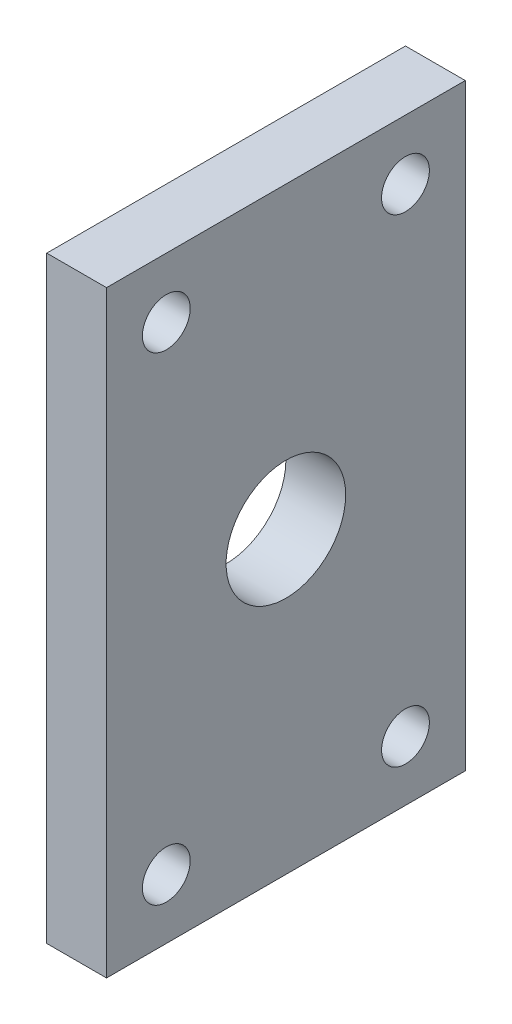
ISO-10303-21;
HEADER;
FILE_DESCRIPTION(('STEP AP214'),'2;1');
FILE_NAME('part.step','',(''),(''),'','','');
FILE_SCHEMA(('AUTOMOTIVE_DESIGN { 1 0 10303 214 1 1 1 1 }'));
ENDSEC;
DATA;
#1=APPLICATION_CONTEXT('core data for automotive mechanical design processes');
#2=APPLICATION_PROTOCOL_DEFINITION('international standard','automotive_design',2000,#1);
#3=PRODUCT_CONTEXT('',#1,'mechanical');
#4=PRODUCT('Part','Part','',(#3));
#5=PRODUCT_RELATED_PRODUCT_CATEGORY('part','',(#4));
#6=PRODUCT_DEFINITION_FORMATION('','',#4);
#7=PRODUCT_DEFINITION_CONTEXT('part definition',#1,'design');
#8=PRODUCT_DEFINITION('design','',#6,#7);
#9=PRODUCT_DEFINITION_SHAPE('','',#8);
#10=(LENGTH_UNIT() NAMED_UNIT(*) SI_UNIT(.MILLI.,.METRE.));
#11=(NAMED_UNIT(*) PLANE_ANGLE_UNIT() SI_UNIT($,.RADIAN.));
#12=(NAMED_UNIT(*) SI_UNIT($,.STERADIAN.) SOLID_ANGLE_UNIT());
#13=UNCERTAINTY_MEASURE_WITH_UNIT(LENGTH_MEASURE(1.E-05),#10,'distance_accuracy_value','');
#14=(GEOMETRIC_REPRESENTATION_CONTEXT(3) GLOBAL_UNCERTAINTY_ASSIGNED_CONTEXT((#13)) GLOBAL_UNIT_ASSIGNED_CONTEXT((#10,
#11,#12)) REPRESENTATION_CONTEXT('',''));
#15=CARTESIAN_POINT('',(0.,0.,0.));
#16=DIRECTION('',(0.,0.,1.));
#17=DIRECTION('',(1.,0.,0.));
#18=AXIS2_PLACEMENT_3D('',#15,#16,#17);
#19=CARTESIAN_POINT('',(10.,0.,0.));
#20=DIRECTION('',(0.,1.,0.));
#21=DIRECTION('',(0.,0.,1.));
#22=AXIS2_PLACEMENT_3D('',#19,#20,#21);
#23=PLANE('',#22);
#24=DIRECTION('',(0.,0.,-1.));
#25=VECTOR('',#24,1.);
#26=CARTESIAN_POINT('',(0.,0.,0.));
#27=LINE('',#26,#25);
#28=CARTESIAN_POINT('',(0.,0.,60.));
#29=VERTEX_POINT('',#28);
#30=CARTESIAN_POINT('',(0.,0.,0.));
#31=VERTEX_POINT('',#30);
#32=EDGE_CURVE('E102',#29,#31,#27,.T.);
#33=ORIENTED_EDGE('',*,*,#32,.T.);
#34=DIRECTION('',(-1.,0.,0.));
#35=VECTOR('',#34,1.);
#36=CARTESIAN_POINT('',(10.,0.,0.));
#37=LINE('',#36,#35);
#38=CARTESIAN_POINT('',(10.,0.,0.));
#39=VERTEX_POINT('',#38);
#40=EDGE_CURVE('E11',#39,#31,#37,.T.);
#41=ORIENTED_EDGE('',*,*,#40,.F.);
#42=DIRECTION('',(0.,0.,-1.));
#43=VECTOR('',#42,1.);
#44=CARTESIAN_POINT('',(10.,0.,0.));
#45=LINE('',#44,#43);
#46=CARTESIAN_POINT('',(10.,0.,60.));
#47=VERTEX_POINT('',#46);
#48=EDGE_CURVE('E90',#47,#39,#45,.T.);
#49=ORIENTED_EDGE('',*,*,#48,.F.);
#50=DIRECTION('',(-1.,0.,0.));
#51=VECTOR('',#50,1.);
#52=CARTESIAN_POINT('',(10.,0.,60.));
#53=LINE('',#52,#51);
#54=EDGE_CURVE('E98',#47,#29,#53,.T.);
#55=ORIENTED_EDGE('',*,*,#54,.T.);
#56=EDGE_LOOP('',(#33,#41,#49,#55));
#57=FACE_BOUND('',#56,.T.);
#58=ADVANCED_FACE('F39',(#57),#23,.F.);
#59=CARTESIAN_POINT('',(10.,0.,0.));
#60=DIRECTION('',(0.,0.,1.));
#61=DIRECTION('',(1.,0.,0.));
#62=AXIS2_PLACEMENT_3D('',#59,#60,#61);
#63=PLANE('',#62);
#64=DIRECTION('',(0.,1.,0.));
#65=VECTOR('',#64,1.);
#66=CARTESIAN_POINT('',(0.,0.,0.));
#67=LINE('',#66,#65);
#68=CARTESIAN_POINT('',(0.,100.,0.));
#69=VERTEX_POINT('',#68);
#70=EDGE_CURVE('E94',#31,#69,#67,.T.);
#71=ORIENTED_EDGE('',*,*,#70,.T.);
#72=DIRECTION('',(-1.,0.,0.));
#73=VECTOR('',#72,1.);
#74=CARTESIAN_POINT('',(10.,100.,0.));
#75=LINE('',#74,#73);
#76=CARTESIAN_POINT('',(10.,100.,0.));
#77=VERTEX_POINT('',#76);
#78=EDGE_CURVE('E47',#77,#69,#75,.T.);
#79=ORIENTED_EDGE('',*,*,#78,.F.);
#80=DIRECTION('',(0.,1.,0.));
#81=VECTOR('',#80,1.);
#82=CARTESIAN_POINT('',(10.,0.,0.));
#83=LINE('',#82,#81);
#84=EDGE_CURVE('E85',#39,#77,#83,.T.);
#85=ORIENTED_EDGE('',*,*,#84,.F.);
#86=ORIENTED_EDGE('',*,*,#40,.T.);
#87=EDGE_LOOP('',(#71,#79,#85,#86));
#88=FACE_BOUND('',#87,.T.);
#89=ADVANCED_FACE('F93',(#88),#63,.F.);
#90=CARTESIAN_POINT('',(10.,100.,0.));
#91=DIRECTION('',(0.,-1.,0.));
#92=DIRECTION('',(0.,0.,-1.));
#93=AXIS2_PLACEMENT_3D('',#90,#91,#92);
#94=PLANE('',#93);
#95=DIRECTION('',(0.,0.,1.));
#96=VECTOR('',#95,1.);
#97=CARTESIAN_POINT('',(0.,100.,0.));
#98=LINE('',#97,#96);
#99=CARTESIAN_POINT('',(0.,100.,60.));
#100=VERTEX_POINT('',#99);
#101=EDGE_CURVE('E72',#69,#100,#98,.T.);
#102=ORIENTED_EDGE('',*,*,#101,.T.);
#103=DIRECTION('',(-1.,0.,0.));
#104=VECTOR('',#103,1.);
#105=CARTESIAN_POINT('',(10.,100.,60.));
#106=LINE('',#105,#104);
#107=CARTESIAN_POINT('',(10.,100.,60.));
#108=VERTEX_POINT('',#107);
#109=EDGE_CURVE('E95',#108,#100,#106,.T.);
#110=ORIENTED_EDGE('',*,*,#109,.F.);
#111=DIRECTION('',(0.,0.,1.));
#112=VECTOR('',#111,1.);
#113=CARTESIAN_POINT('',(10.,100.,0.));
#114=LINE('',#113,#112);
#115=EDGE_CURVE('E88',#77,#108,#114,.T.);
#116=ORIENTED_EDGE('',*,*,#115,.F.);
#117=ORIENTED_EDGE('',*,*,#78,.T.);
#118=EDGE_LOOP('',(#102,#110,#116,#117));
#119=FACE_BOUND('',#118,.T.);
#120=ADVANCED_FACE('F96',(#119),#94,.F.);
#121=CARTESIAN_POINT('',(10.,0.,60.));
#122=DIRECTION('',(0.,0.,-1.));
#123=DIRECTION('',(-1.,0.,0.));
#124=AXIS2_PLACEMENT_3D('',#121,#122,#123);
#125=PLANE('',#124);
#126=DIRECTION('',(0.,-1.,0.));
#127=VECTOR('',#126,1.);
#128=CARTESIAN_POINT('',(0.,0.,60.));
#129=LINE('',#128,#127);
#130=EDGE_CURVE('E78',#100,#29,#129,.T.);
#131=ORIENTED_EDGE('',*,*,#130,.T.);
#132=ORIENTED_EDGE('',*,*,#54,.F.);
#133=DIRECTION('',(0.,-1.,0.));
#134=VECTOR('',#133,1.);
#135=CARTESIAN_POINT('',(10.,0.,60.));
#136=LINE('',#135,#134);
#137=EDGE_CURVE('E55',#108,#47,#136,.T.);
#138=ORIENTED_EDGE('',*,*,#137,.F.);
#139=ORIENTED_EDGE('',*,*,#109,.T.);
#140=EDGE_LOOP('',(#131,#132,#138,#139));
#141=FACE_BOUND('',#140,.T.);
#142=ADVANCED_FACE('F110',(#141),#125,.F.);
#143=CARTESIAN_POINT('',(10.,0.,0.));
#144=DIRECTION('',(-1.,0.,0.));
#145=DIRECTION('',(0.,0.,1.));
#146=AXIS2_PLACEMENT_3D('',#143,#144,#145);
#147=PLANE('',#146);
#148=CARTESIAN_POINT('',(10.,50.,30.));
#149=DIRECTION('',(1.,0.,0.));
#150=DIRECTION('',(0.,0.,-1.));
#151=AXIS2_PLACEMENT_3D('',#148,#149,#150);
#152=CIRCLE('',#151,10.);
#153=CARTESIAN_POINT('',(10.,50.,20.));
#154=VERTEX_POINT('',#153);
#155=EDGE_CURVE('E137',#154,#154,#152,.T.);
#156=ORIENTED_EDGE('',*,*,#155,.F.);
#157=EDGE_LOOP('',(#156));
#158=FACE_BOUND('',#157,.T.);
#159=CARTESIAN_POINT('',(10.,90.,10.));
#160=DIRECTION('',(1.,0.,0.));
#161=DIRECTION('',(0.,0.,-1.));
#162=AXIS2_PLACEMENT_3D('',#159,#160,#161);
#163=CIRCLE('',#162,4.00000000000001);
#164=CARTESIAN_POINT('',(10.,90.,5.99999999999999));
#165=VERTEX_POINT('',#164);
#166=EDGE_CURVE('E129',#165,#165,#163,.T.);
#167=ORIENTED_EDGE('',*,*,#166,.F.);
#168=EDGE_LOOP('',(#167));
#169=FACE_BOUND('',#168,.T.);
#170=CARTESIAN_POINT('',(10.,10.,50.));
#171=DIRECTION('',(1.,0.,0.));
#172=DIRECTION('',(0.,0.,-1.));
#173=AXIS2_PLACEMENT_3D('',#170,#171,#172);
#174=CIRCLE('',#173,4.);
#175=CARTESIAN_POINT('',(10.,10.,46.));
#176=VERTEX_POINT('',#175);
#177=EDGE_CURVE('E122',#176,#176,#174,.T.);
#178=ORIENTED_EDGE('',*,*,#177,.F.);
#179=EDGE_LOOP('',(#178));
#180=FACE_BOUND('',#179,.T.);
#181=CARTESIAN_POINT('',(10.,90.,50.));
#182=DIRECTION('',(1.,0.,0.));
#183=DIRECTION('',(0.,0.,-1.));
#184=AXIS2_PLACEMENT_3D('',#181,#182,#183);
#185=CIRCLE('',#184,4.00000000000001);
#186=CARTESIAN_POINT('',(10.,90.,46.));
#187=VERTEX_POINT('',#186);
#188=EDGE_CURVE('E134',#187,#187,#185,.T.);
#189=ORIENTED_EDGE('',*,*,#188,.F.);
#190=EDGE_LOOP('',(#189));
#191=FACE_BOUND('',#190,.T.);
#192=CARTESIAN_POINT('',(10.,10.,10.));
#193=DIRECTION('',(1.,0.,0.));
#194=DIRECTION('',(0.,0.,-1.));
#195=AXIS2_PLACEMENT_3D('',#192,#193,#194);
#196=CIRCLE('',#195,4.);
#197=CARTESIAN_POINT('',(10.,10.,6.));
#198=VERTEX_POINT('',#197);
#199=EDGE_CURVE('E105',#198,#198,#196,.T.);
#200=ORIENTED_EDGE('',*,*,#199,.F.);
#201=EDGE_LOOP('',(#200));
#202=FACE_BOUND('',#201,.T.);
#203=ORIENTED_EDGE('',*,*,#48,.T.);
#204=ORIENTED_EDGE('',*,*,#84,.T.);
#205=ORIENTED_EDGE('',*,*,#115,.T.);
#206=ORIENTED_EDGE('',*,*,#137,.T.);
#207=EDGE_LOOP('',(#203,#204,#205,#206));
#208=FACE_BOUND('',#207,.T.);
#209=ADVANCED_FACE('F86',(#158,#169,#180,#191,#202,#208),#147,.F.);
#210=CARTESIAN_POINT('',(0.,0.,0.));
#211=DIRECTION('',(-1.,0.,0.));
#212=DIRECTION('',(0.,0.,1.));
#213=AXIS2_PLACEMENT_3D('',#210,#211,#212);
#214=PLANE('',#213);
#215=CARTESIAN_POINT('',(0.,50.,30.));
#216=DIRECTION('',(1.,0.,0.));
#217=DIRECTION('',(0.,0.,-1.));
#218=AXIS2_PLACEMENT_3D('',#215,#216,#217);
#219=CIRCLE('',#218,10.);
#220=CARTESIAN_POINT('',(0.,50.,20.));
#221=VERTEX_POINT('',#220);
#222=EDGE_CURVE('E140',#221,#221,#219,.T.);
#223=ORIENTED_EDGE('',*,*,#222,.T.);
#224=EDGE_LOOP('',(#223));
#225=FACE_BOUND('',#224,.T.);
#226=CARTESIAN_POINT('',(0.,90.,10.));
#227=DIRECTION('',(1.,0.,0.));
#228=DIRECTION('',(0.,0.,-1.));
#229=AXIS2_PLACEMENT_3D('',#226,#227,#228);
#230=CIRCLE('',#229,4.00000000000001);
#231=CARTESIAN_POINT('',(0.,90.,5.99999999999999));
#232=VERTEX_POINT('',#231);
#233=EDGE_CURVE('E119',#232,#232,#230,.T.);
#234=ORIENTED_EDGE('',*,*,#233,.T.);
#235=EDGE_LOOP('',(#234));
#236=FACE_BOUND('',#235,.T.);
#237=CARTESIAN_POINT('',(0.,10.,50.));
#238=DIRECTION('',(1.,0.,0.));
#239=DIRECTION('',(0.,0.,-1.));
#240=AXIS2_PLACEMENT_3D('',#237,#238,#239);
#241=CIRCLE('',#240,4.);
#242=CARTESIAN_POINT('',(0.,10.,46.));
#243=VERTEX_POINT('',#242);
#244=EDGE_CURVE('E125',#243,#243,#241,.T.);
#245=ORIENTED_EDGE('',*,*,#244,.T.);
#246=EDGE_LOOP('',(#245));
#247=FACE_BOUND('',#246,.T.);
#248=CARTESIAN_POINT('',(0.,90.,50.));
#249=DIRECTION('',(1.,0.,0.));
#250=DIRECTION('',(0.,0.,-1.));
#251=AXIS2_PLACEMENT_3D('',#248,#249,#250);
#252=CIRCLE('',#251,4.00000000000001);
#253=CARTESIAN_POINT('',(0.,90.,46.));
#254=VERTEX_POINT('',#253);
#255=EDGE_CURVE('E126',#254,#254,#252,.T.);
#256=ORIENTED_EDGE('',*,*,#255,.T.);
#257=EDGE_LOOP('',(#256));
#258=FACE_BOUND('',#257,.T.);
#259=CARTESIAN_POINT('',(0.,10.,10.));
#260=DIRECTION('',(1.,0.,0.));
#261=DIRECTION('',(0.,0.,-1.));
#262=AXIS2_PLACEMENT_3D('',#259,#260,#261);
#263=CIRCLE('',#262,4.);
#264=CARTESIAN_POINT('',(0.,10.,6.));
#265=VERTEX_POINT('',#264);
#266=EDGE_CURVE('E116',#265,#265,#263,.T.);
#267=ORIENTED_EDGE('',*,*,#266,.T.);
#268=EDGE_LOOP('',(#267));
#269=FACE_BOUND('',#268,.T.);
#270=ORIENTED_EDGE('',*,*,#32,.F.);
#271=ORIENTED_EDGE('',*,*,#130,.F.);
#272=ORIENTED_EDGE('',*,*,#101,.F.);
#273=ORIENTED_EDGE('',*,*,#70,.F.);
#274=EDGE_LOOP('',(#270,#271,#272,#273));
#275=FACE_BOUND('',#274,.T.);
#276=ADVANCED_FACE('F113',(#225,#236,#247,#258,#269,#275),#214,.T.);
#277=CARTESIAN_POINT('',(10.,10.,10.));
#278=DIRECTION('',(-1.,0.,0.));
#279=DIRECTION('',(0.,0.,1.));
#280=AXIS2_PLACEMENT_3D('',#277,#278,#279);
#281=CYLINDRICAL_SURFACE('',#280,4.);
#282=ORIENTED_EDGE('',*,*,#199,.T.);
#283=EDGE_LOOP('',(#282));
#284=FACE_BOUND('',#283,.T.);
#285=ORIENTED_EDGE('',*,*,#266,.F.);
#286=EDGE_LOOP('',(#285));
#287=FACE_BOUND('',#286,.T.);
#288=ADVANCED_FACE('F160',(#284,#287),#281,.F.);
#289=CARTESIAN_POINT('',(10.,90.,50.));
#290=DIRECTION('',(-1.,0.,0.));
#291=DIRECTION('',(0.,0.,1.));
#292=AXIS2_PLACEMENT_3D('',#289,#290,#291);
#293=CYLINDRICAL_SURFACE('',#292,4.00000000000001);
#294=ORIENTED_EDGE('',*,*,#188,.T.);
#295=EDGE_LOOP('',(#294));
#296=FACE_BOUND('',#295,.T.);
#297=ORIENTED_EDGE('',*,*,#255,.F.);
#298=EDGE_LOOP('',(#297));
#299=FACE_BOUND('',#298,.T.);
#300=ADVANCED_FACE('F163',(#296,#299),#293,.F.);
#301=CARTESIAN_POINT('',(10.,10.,50.));
#302=DIRECTION('',(-1.,0.,0.));
#303=DIRECTION('',(0.,0.,1.));
#304=AXIS2_PLACEMENT_3D('',#301,#302,#303);
#305=CYLINDRICAL_SURFACE('',#304,4.);
#306=ORIENTED_EDGE('',*,*,#177,.T.);
#307=EDGE_LOOP('',(#306));
#308=FACE_BOUND('',#307,.T.);
#309=ORIENTED_EDGE('',*,*,#244,.F.);
#310=EDGE_LOOP('',(#309));
#311=FACE_BOUND('',#310,.T.);
#312=ADVANCED_FACE('F201',(#308,#311),#305,.F.);
#313=CARTESIAN_POINT('',(10.,90.,10.));
#314=DIRECTION('',(-1.,0.,0.));
#315=DIRECTION('',(0.,0.,1.));
#316=AXIS2_PLACEMENT_3D('',#313,#314,#315);
#317=CYLINDRICAL_SURFACE('',#316,4.00000000000001);
#318=ORIENTED_EDGE('',*,*,#166,.T.);
#319=EDGE_LOOP('',(#318));
#320=FACE_BOUND('',#319,.T.);
#321=ORIENTED_EDGE('',*,*,#233,.F.);
#322=EDGE_LOOP('',(#321));
#323=FACE_BOUND('',#322,.T.);
#324=ADVANCED_FACE('F210',(#320,#323),#317,.F.);
#325=CARTESIAN_POINT('',(10.,50.,30.));
#326=DIRECTION('',(-1.,0.,0.));
#327=DIRECTION('',(0.,0.,1.));
#328=AXIS2_PLACEMENT_3D('',#325,#326,#327);
#329=CYLINDRICAL_SURFACE('',#328,10.);
#330=ORIENTED_EDGE('',*,*,#155,.T.);
#331=EDGE_LOOP('',(#330));
#332=FACE_BOUND('',#331,.T.);
#333=ORIENTED_EDGE('',*,*,#222,.F.);
#334=EDGE_LOOP('',(#333));
#335=FACE_BOUND('',#334,.T.);
#336=ADVANCED_FACE('F146',(#332,#335),#329,.F.);
#337=CLOSED_SHELL('',(#58,#89,#120,#142,#209,#276,#288,#300,#312,#324,#336));
#338=MANIFOLD_SOLID_BREP('B2',#337);
#339=ADVANCED_BREP_SHAPE_REPRESENTATION('',(#18,#338),#14);
#340=SHAPE_DEFINITION_REPRESENTATION(#9,#339);
ENDSEC;
END-ISO-10303-21;
